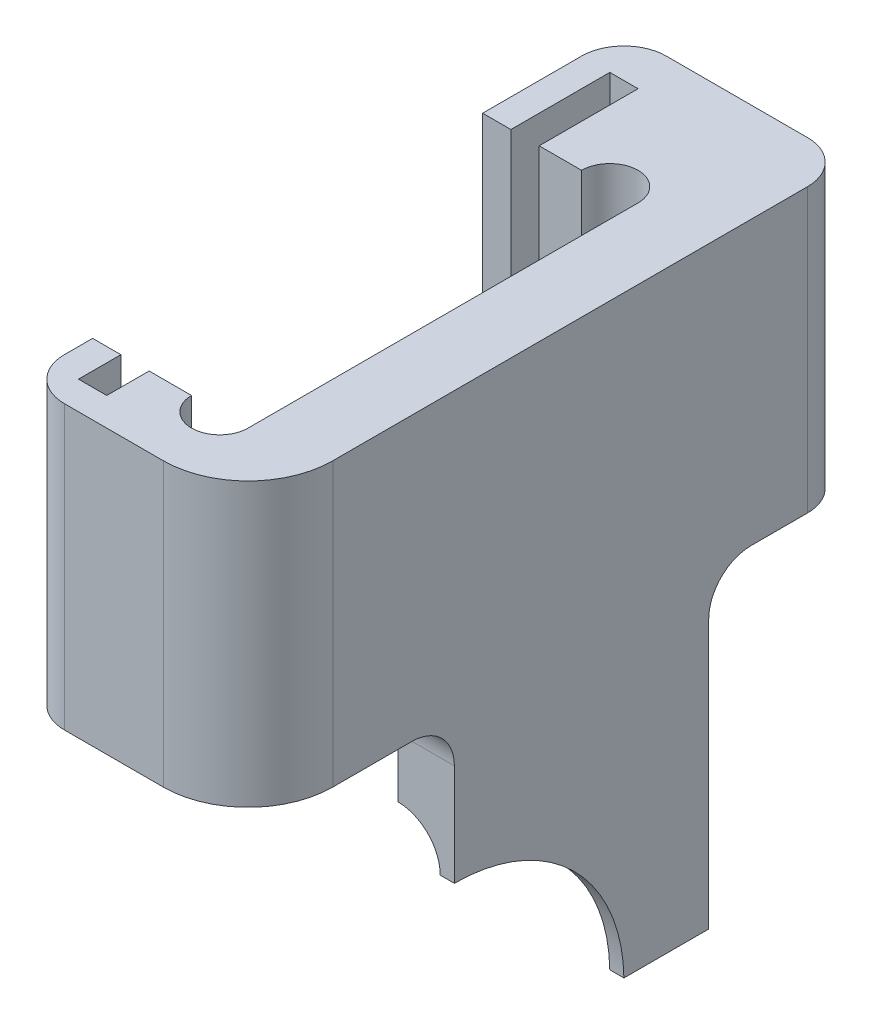
ISO-10303-21;
HEADER;
FILE_DESCRIPTION(('STEP AP214'),'2;1');
FILE_NAME('part.step','',(''),(''),'','','');
FILE_SCHEMA(('AUTOMOTIVE_DESIGN { 1 0 10303 214 1 1 1 1 }'));
ENDSEC;
DATA;
#1=APPLICATION_CONTEXT('core data for automotive mechanical design processes');
#2=APPLICATION_PROTOCOL_DEFINITION('international standard','automotive_design',2000,#1);
#3=PRODUCT_CONTEXT('',#1,'mechanical');
#4=PRODUCT('Part','Part','',(#3));
#5=PRODUCT_RELATED_PRODUCT_CATEGORY('part','',(#4));
#6=PRODUCT_DEFINITION_FORMATION('','',#4);
#7=PRODUCT_DEFINITION_CONTEXT('part definition',#1,'design');
#8=PRODUCT_DEFINITION('design','',#6,#7);
#9=PRODUCT_DEFINITION_SHAPE('','',#8);
#10=(LENGTH_UNIT() NAMED_UNIT(*) SI_UNIT(.MILLI.,.METRE.));
#11=(NAMED_UNIT(*) PLANE_ANGLE_UNIT() SI_UNIT($,.RADIAN.));
#12=(NAMED_UNIT(*) SI_UNIT($,.STERADIAN.) SOLID_ANGLE_UNIT());
#13=UNCERTAINTY_MEASURE_WITH_UNIT(LENGTH_MEASURE(1.E-05),#10,'distance_accuracy_value','');
#14=(GEOMETRIC_REPRESENTATION_CONTEXT(3) GLOBAL_UNCERTAINTY_ASSIGNED_CONTEXT((#13)) GLOBAL_UNIT_ASSIGNED_CONTEXT((#10,
#11,#12)) REPRESENTATION_CONTEXT('',''));
#15=CARTESIAN_POINT('',(0.,0.,0.));
#16=DIRECTION('',(0.,0.,1.));
#17=DIRECTION('',(1.,0.,0.));
#18=AXIS2_PLACEMENT_3D('',#15,#16,#17);
#19=CARTESIAN_POINT('',(0.,20.,0.));
#20=DIRECTION('',(1.,0.,0.));
#21=DIRECTION('',(0.,0.,-1.));
#22=AXIS2_PLACEMENT_3D('',#19,#20,#21);
#23=PLANE('',#22);
#24=DIRECTION('',(0.,-1.,0.));
#25=VECTOR('',#24,1.);
#26=CARTESIAN_POINT('',(0.,20.,-15.3));
#27=LINE('',#26,#25);
#28=CARTESIAN_POINT('',(0.,20.,-15.3));
#29=VERTEX_POINT('',#28);
#30=CARTESIAN_POINT('',(0.,0.,-15.3));
#31=VERTEX_POINT('',#30);
#32=EDGE_CURVE('E363',#29,#31,#27,.T.);
#33=ORIENTED_EDGE('',*,*,#32,.T.);
#34=DIRECTION('',(0.,0.,1.));
#35=VECTOR('',#34,1.);
#36=CARTESIAN_POINT('',(0.,0.,0.));
#37=LINE('',#36,#35);
#38=CARTESIAN_POINT('',(0.,0.,12.3));
#39=VERTEX_POINT('',#38);
#40=EDGE_CURVE('E339',#31,#39,#37,.T.);
#41=ORIENTED_EDGE('',*,*,#40,.T.);
#42=DIRECTION('',(0.,-1.,0.));
#43=VECTOR('',#42,1.);
#44=CARTESIAN_POINT('',(0.,20.,12.3));
#45=LINE('',#44,#43);
#46=CARTESIAN_POINT('',(0.,20.,12.3));
#47=VERTEX_POINT('',#46);
#48=EDGE_CURVE('E398',#47,#39,#45,.T.);
#49=ORIENTED_EDGE('',*,*,#48,.F.);
#50=DIRECTION('',(0.,0.,1.));
#51=VECTOR('',#50,1.);
#52=CARTESIAN_POINT('',(0.,20.,0.));
#53=LINE('',#52,#51);
#54=EDGE_CURVE('E340',#29,#47,#53,.T.);
#55=ORIENTED_EDGE('',*,*,#54,.F.);
#56=EDGE_LOOP('',(#33,#41,#49,#55));
#57=FACE_BOUND('',#56,.T.);
#58=ADVANCED_FACE('F41',(#57),#23,.F.);
#59=CARTESIAN_POINT('',(-11.,20.,-22.3));
#60=DIRECTION('',(0.,0.,-1.));
#61=DIRECTION('',(-1.,0.,0.));
#62=AXIS2_PLACEMENT_3D('',#59,#60,#61);
#63=PLANE('',#62);
#64=DIRECTION('',(0.,1.,0.));
#65=VECTOR('',#64,1.);
#66=CARTESIAN_POINT('',(-8.99999999999999,20.,-22.3));
#67=LINE('',#66,#65);
#68=CARTESIAN_POINT('',(-8.99999999999999,0.,-22.3));
#69=VERTEX_POINT('',#68);
#70=CARTESIAN_POINT('',(-8.99999999999999,20.,-22.3));
#71=VERTEX_POINT('',#70);
#72=EDGE_CURVE('E265',#69,#71,#67,.T.);
#73=ORIENTED_EDGE('',*,*,#72,.F.);
#74=DIRECTION('',(1.,0.,0.));
#75=VECTOR('',#74,1.);
#76=CARTESIAN_POINT('',(-11.,0.,-22.3));
#77=LINE('',#76,#75);
#78=CARTESIAN_POINT('',(-7.,0.,-22.3));
#79=VERTEX_POINT('',#78);
#80=EDGE_CURVE('E304',#69,#79,#77,.T.);
#81=ORIENTED_EDGE('',*,*,#80,.T.);
#82=DIRECTION('',(0.,1.,0.));
#83=VECTOR('',#82,1.);
#84=CARTESIAN_POINT('',(-7.,20.,-22.3));
#85=LINE('',#84,#83);
#86=CARTESIAN_POINT('',(-7.,20.,-22.3));
#87=VERTEX_POINT('',#86);
#88=EDGE_CURVE('E309',#79,#87,#85,.T.);
#89=ORIENTED_EDGE('',*,*,#88,.T.);
#90=DIRECTION('',(1.,0.,0.));
#91=VECTOR('',#90,1.);
#92=CARTESIAN_POINT('',(-11.,20.,-22.3));
#93=LINE('',#92,#91);
#94=EDGE_CURVE('E306',#71,#87,#93,.T.);
#95=ORIENTED_EDGE('',*,*,#94,.F.);
#96=EDGE_LOOP('',(#73,#81,#89,#95));
#97=FACE_BOUND('',#96,.T.);
#98=ADVANCED_FACE('F483',(#97),#63,.F.);
#99=CARTESIAN_POINT('',(-11.,20.,15.3));
#100=DIRECTION('',(0.,0.,1.));
#101=DIRECTION('',(1.,0.,0.));
#102=AXIS2_PLACEMENT_3D('',#99,#100,#101);
#103=PLANE('',#102);
#104=DIRECTION('',(0.,-1.,0.));
#105=VECTOR('',#104,1.);
#106=CARTESIAN_POINT('',(-8.99999999999999,20.,15.3));
#107=LINE('',#106,#105);
#108=CARTESIAN_POINT('',(-8.99999999999999,20.,15.3));
#109=VERTEX_POINT('',#108);
#110=CARTESIAN_POINT('',(-8.99999999999999,0.,15.3));
#111=VERTEX_POINT('',#110);
#112=EDGE_CURVE('E277',#109,#111,#107,.T.);
#113=ORIENTED_EDGE('',*,*,#112,.F.);
#114=DIRECTION('',(1.,0.,0.));
#115=VECTOR('',#114,1.);
#116=CARTESIAN_POINT('',(-11.,20.,15.3));
#117=LINE('',#116,#115);
#118=CARTESIAN_POINT('',(-7.,20.,15.3));
#119=VERTEX_POINT('',#118);
#120=EDGE_CURVE('E326',#109,#119,#117,.T.);
#121=ORIENTED_EDGE('',*,*,#120,.T.);
#122=DIRECTION('',(0.,-1.,0.));
#123=VECTOR('',#122,1.);
#124=CARTESIAN_POINT('',(-6.99999999999999,20.,15.3));
#125=LINE('',#124,#123);
#126=CARTESIAN_POINT('',(-7.,0.,15.3));
#127=VERTEX_POINT('',#126);
#128=EDGE_CURVE('E312',#119,#127,#125,.T.);
#129=ORIENTED_EDGE('',*,*,#128,.T.);
#130=DIRECTION('',(1.,0.,0.));
#131=VECTOR('',#130,1.);
#132=CARTESIAN_POINT('',(-11.,0.,15.3));
#133=LINE('',#132,#131);
#134=EDGE_CURVE('E322',#111,#127,#133,.T.);
#135=ORIENTED_EDGE('',*,*,#134,.F.);
#136=EDGE_LOOP('',(#113,#121,#129,#135));
#137=FACE_BOUND('',#136,.T.);
#138=ADVANCED_FACE('F486',(#137),#103,.F.);
#139=CARTESIAN_POINT('',(-7.,20.,0.));
#140=DIRECTION('',(-1.,0.,0.));
#141=DIRECTION('',(0.,0.,1.));
#142=AXIS2_PLACEMENT_3D('',#139,#140,#141);
#143=PLANE('',#142);
#144=DIRECTION('',(0.,0.,-1.));
#145=VECTOR('',#144,1.);
#146=CARTESIAN_POINT('',(-7.,20.,0.));
#147=LINE('',#146,#145);
#148=CARTESIAN_POINT('',(-7.,20.,-15.3));
#149=VERTEX_POINT('',#148);
#150=EDGE_CURVE('E355',#149,#87,#147,.T.);
#151=ORIENTED_EDGE('',*,*,#150,.T.);
#152=ORIENTED_EDGE('',*,*,#88,.F.);
#153=DIRECTION('',(0.,0.,-1.));
#154=VECTOR('',#153,1.);
#155=CARTESIAN_POINT('',(-7.,0.,0.));
#156=LINE('',#155,#154);
#157=CARTESIAN_POINT('',(-7.,0.,-15.3));
#158=VERTEX_POINT('',#157);
#159=EDGE_CURVE('E378',#158,#79,#156,.T.);
#160=ORIENTED_EDGE('',*,*,#159,.F.);
#161=DIRECTION('',(0.,-1.,0.));
#162=VECTOR('',#161,1.);
#163=CARTESIAN_POINT('',(-7.,20.,-15.3));
#164=LINE('',#163,#162);
#165=EDGE_CURVE('E390',#149,#158,#164,.T.);
#166=ORIENTED_EDGE('',*,*,#165,.F.);
#167=EDGE_LOOP('',(#151,#152,#160,#166));
#168=FACE_BOUND('',#167,.T.);
#169=ADVANCED_FACE('F498',(#168),#143,.T.);
#170=CARTESIAN_POINT('',(-7.,20.,0.));
#171=DIRECTION('',(1.,0.,0.));
#172=DIRECTION('',(0.,0.,-1.));
#173=AXIS2_PLACEMENT_3D('',#170,#171,#172);
#174=PLANE('',#173);
#175=ORIENTED_EDGE('',*,*,#128,.F.);
#176=DIRECTION('',(0.,0.,1.));
#177=VECTOR('',#176,1.);
#178=CARTESIAN_POINT('',(-7.,20.,0.));
#179=LINE('',#178,#177);
#180=CARTESIAN_POINT('',(-7.,20.,12.3));
#181=VERTEX_POINT('',#180);
#182=EDGE_CURVE('E348',#181,#119,#179,.T.);
#183=ORIENTED_EDGE('',*,*,#182,.F.);
#184=DIRECTION('',(0.,-1.,0.));
#185=VECTOR('',#184,1.);
#186=CARTESIAN_POINT('',(-7.,20.,12.3));
#187=LINE('',#186,#185);
#188=CARTESIAN_POINT('',(-7.,0.,12.3));
#189=VERTEX_POINT('',#188);
#190=EDGE_CURVE('E392',#181,#189,#187,.T.);
#191=ORIENTED_EDGE('',*,*,#190,.T.);
#192=DIRECTION('',(0.,0.,1.));
#193=VECTOR('',#192,1.);
#194=CARTESIAN_POINT('',(-7.,0.,0.));
#195=LINE('',#194,#193);
#196=EDGE_CURVE('E369',#189,#127,#195,.T.);
#197=ORIENTED_EDGE('',*,*,#196,.T.);
#198=EDGE_LOOP('',(#175,#183,#191,#197));
#199=FACE_BOUND('',#198,.T.);
#200=ADVANCED_FACE('F532',(#199),#174,.F.);
#201=CARTESIAN_POINT('',(-2.,20.,12.3));
#202=DIRECTION('',(0.,-1.,0.));
#203=DIRECTION('',(0.,0.,-1.));
#204=AXIS2_PLACEMENT_3D('',#201,#202,#203);
#205=CYLINDRICAL_SURFACE('',#204,2.);
#206=CARTESIAN_POINT('',(-2.,0.,12.3));
#207=DIRECTION('',(0.,1.,0.));
#208=DIRECTION('',(0.,0.,1.));
#209=AXIS2_PLACEMENT_3D('',#206,#207,#208);
#210=CIRCLE('',#209,2.);
#211=CARTESIAN_POINT('',(-4.,0.,12.3));
#212=VERTEX_POINT('',#211);
#213=EDGE_CURVE('E365',#39,#212,#210,.F.);
#214=ORIENTED_EDGE('',*,*,#213,.T.);
#215=DIRECTION('',(0.,-1.,0.));
#216=VECTOR('',#215,1.);
#217=CARTESIAN_POINT('',(-4.,20.,12.3));
#218=LINE('',#217,#216);
#219=CARTESIAN_POINT('',(-4.,20.,12.3));
#220=VERTEX_POINT('',#219);
#221=EDGE_CURVE('E395',#220,#212,#218,.T.);
#222=ORIENTED_EDGE('',*,*,#221,.F.);
#223=CARTESIAN_POINT('',(-2.,20.,12.3));
#224=DIRECTION('',(0.,1.,0.));
#225=DIRECTION('',(0.,0.,1.));
#226=AXIS2_PLACEMENT_3D('',#223,#224,#225);
#227=CIRCLE('',#226,2.);
#228=EDGE_CURVE('E343',#47,#220,#227,.F.);
#229=ORIENTED_EDGE('',*,*,#228,.F.);
#230=ORIENTED_EDGE('',*,*,#48,.T.);
#231=EDGE_LOOP('',(#214,#222,#229,#230));
#232=FACE_BOUND('',#231,.T.);
#233=ADVANCED_FACE('F543',(#232),#205,.F.);
#234=CARTESIAN_POINT('',(0.,20.,12.3));
#235=DIRECTION('',(0.,0.,1.));
#236=DIRECTION('',(1.,0.,0.));
#237=AXIS2_PLACEMENT_3D('',#234,#235,#236);
#238=PLANE('',#237);
#239=DIRECTION('',(-1.,0.,0.));
#240=VECTOR('',#239,1.);
#241=CARTESIAN_POINT('',(0.,0.,12.3));
#242=LINE('',#241,#240);
#243=EDGE_CURVE('E367',#212,#189,#242,.T.);
#244=ORIENTED_EDGE('',*,*,#243,.T.);
#245=ORIENTED_EDGE('',*,*,#190,.F.);
#246=DIRECTION('',(-1.,0.,0.));
#247=VECTOR('',#246,1.);
#248=CARTESIAN_POINT('',(0.,20.,12.3));
#249=LINE('',#248,#247);
#250=EDGE_CURVE('E346',#220,#181,#249,.T.);
#251=ORIENTED_EDGE('',*,*,#250,.F.);
#252=ORIENTED_EDGE('',*,*,#221,.T.);
#253=EDGE_LOOP('',(#244,#245,#251,#252));
#254=FACE_BOUND('',#253,.T.);
#255=ADVANCED_FACE('F539',(#254),#238,.F.);
#256=CARTESIAN_POINT('',(0.,20.,17.3));
#257=DIRECTION('',(0.,0.,-1.));
#258=DIRECTION('',(-1.,0.,0.));
#259=AXIS2_PLACEMENT_3D('',#256,#257,#258);
#260=PLANE('',#259);
#261=DIRECTION('',(1.,0.,0.));
#262=VECTOR('',#261,1.);
#263=CARTESIAN_POINT('',(0.,20.,17.3));
#264=LINE('',#263,#262);
#265=CARTESIAN_POINT('',(-7.99999999999999,20.,17.3));
#266=VERTEX_POINT('',#265);
#267=CARTESIAN_POINT('',(-0.999999999999993,20.,17.3));
#268=VERTEX_POINT('',#267);
#269=EDGE_CURVE('E351',#266,#268,#264,.T.);
#270=ORIENTED_EDGE('',*,*,#269,.F.);
#271=DIRECTION('',(0.,1.,0.));
#272=VECTOR('',#271,1.);
#273=CARTESIAN_POINT('',(-7.99999999999999,20.,17.3));
#274=LINE('',#273,#272);
#275=CARTESIAN_POINT('',(-7.99999999999999,0.,17.3));
#276=VERTEX_POINT('',#275);
#277=EDGE_CURVE('E430',#266,#276,#274,.F.);
#278=ORIENTED_EDGE('',*,*,#277,.T.);
#279=DIRECTION('',(1.,0.,0.));
#280=VECTOR('',#279,1.);
#281=CARTESIAN_POINT('',(0.,0.,17.3));
#282=LINE('',#281,#280);
#283=CARTESIAN_POINT('',(-0.999999999999993,0.,17.3));
#284=VERTEX_POINT('',#283);
#285=EDGE_CURVE('E372',#276,#284,#282,.T.);
#286=ORIENTED_EDGE('',*,*,#285,.T.);
#287=DIRECTION('',(0.,-1.,0.));
#288=VECTOR('',#287,1.);
#289=CARTESIAN_POINT('',(-0.999999999999993,20.,17.3));
#290=LINE('',#289,#288);
#291=EDGE_CURVE('E407',#284,#268,#290,.F.);
#292=ORIENTED_EDGE('',*,*,#291,.T.);
#293=EDGE_LOOP('',(#270,#278,#286,#292));
#294=FACE_BOUND('',#293,.T.);
#295=ADVANCED_FACE('F536',(#294),#260,.F.);
#296=CARTESIAN_POINT('',(5.,20.,0.));
#297=DIRECTION('',(1.,0.,0.));
#298=DIRECTION('',(0.,0.,-1.));
#299=AXIS2_PLACEMENT_3D('',#296,#297,#298);
#300=PLANE('',#299);
#301=DIRECTION('',(0.,0.,1.));
#302=VECTOR('',#301,1.);
#303=CARTESIAN_POINT('',(5.,0.,0.));
#304=LINE('',#303,#302);
#305=CARTESIAN_POINT('',(5.,0.,5.7));
#306=VERTEX_POINT('',#305);
#307=CARTESIAN_POINT('',(5.,0.,11.3));
#308=VERTEX_POINT('',#307);
#309=EDGE_CURVE('E374',#306,#308,#304,.T.);
#310=ORIENTED_EDGE('',*,*,#309,.F.);
#311=CARTESIAN_POINT('',(5.,-3.,5.7));
#312=DIRECTION('',(1.,0.,0.));
#313=DIRECTION('',(0.,0.,-1.));
#314=AXIS2_PLACEMENT_3D('',#311,#312,#313);
#315=CIRCLE('',#314,3.);
#316=CARTESIAN_POINT('',(5.,-3.,2.7));
#317=VERTEX_POINT('',#316);
#318=EDGE_CURVE('E11',#306,#317,#315,.F.);
#319=ORIENTED_EDGE('',*,*,#318,.T.);
#320=DIRECTION('',(0.,-1.,0.));
#321=VECTOR('',#320,1.);
#322=CARTESIAN_POINT('',(5.,0.,2.7));
#323=LINE('',#322,#321);
#324=CARTESIAN_POINT('',(5.,-10.2,2.7));
#325=VERTEX_POINT('',#324);
#326=EDGE_CURVE('E654',#317,#325,#323,.T.);
#327=ORIENTED_EDGE('',*,*,#326,.T.);
#328=CARTESIAN_POINT('',(5.,-22.2,2.7));
#329=DIRECTION('',(1.,0.,0.));
#330=DIRECTION('',(0.,0.,-1.));
#331=AXIS2_PLACEMENT_3D('',#328,#329,#330);
#332=CIRCLE('',#331,12.);
#333=CARTESIAN_POINT('',(5.,-22.,-9.29833321757652));
#334=VERTEX_POINT('',#333);
#335=EDGE_CURVE('E650',#325,#334,#332,.F.);
#336=ORIENTED_EDGE('',*,*,#335,.T.);
#337=DIRECTION('',(0.,0.,1.));
#338=VECTOR('',#337,1.);
#339=CARTESIAN_POINT('',(5.,-22.,-15.3));
#340=LINE('',#339,#338);
#341=CARTESIAN_POINT('',(5.,-22.,-15.3));
#342=VERTEX_POINT('',#341);
#343=EDGE_CURVE('E267',#342,#334,#340,.T.);
#344=ORIENTED_EDGE('',*,*,#343,.F.);
#345=DIRECTION('',(0.,-1.,0.));
#346=VECTOR('',#345,1.);
#347=CARTESIAN_POINT('',(5.,0.,-15.3));
#348=LINE('',#347,#346);
#349=CARTESIAN_POINT('',(5.,-3.,-15.3));
#350=VERTEX_POINT('',#349);
#351=EDGE_CURVE('E262',#350,#342,#348,.T.);
#352=ORIENTED_EDGE('',*,*,#351,.F.);
#353=CARTESIAN_POINT('',(5.,-3.,-18.3));
#354=DIRECTION('',(1.,0.,0.));
#355=DIRECTION('',(0.,0.,-1.));
#356=AXIS2_PLACEMENT_3D('',#353,#354,#355);
#357=CIRCLE('',#356,3.);
#358=CARTESIAN_POINT('',(5.,0.,-18.3));
#359=VERTEX_POINT('',#358);
#360=EDGE_CURVE('E626',#350,#359,#357,.F.);
#361=ORIENTED_EDGE('',*,*,#360,.T.);
#362=CARTESIAN_POINT('',(5.,0.,-22.3));
#363=VERTEX_POINT('',#362);
#364=EDGE_CURVE('E375',#363,#359,#304,.T.);
#365=ORIENTED_EDGE('',*,*,#364,.F.);
#366=DIRECTION('',(0.,-1.,0.));
#367=VECTOR('',#366,1.);
#368=CARTESIAN_POINT('',(5.,20.,-22.3));
#369=LINE('',#368,#367);
#370=CARTESIAN_POINT('',(5.,20.,-22.3));
#371=VERTEX_POINT('',#370);
#372=EDGE_CURVE('E418',#363,#371,#369,.F.);
#373=ORIENTED_EDGE('',*,*,#372,.T.);
#374=DIRECTION('',(0.,0.,1.));
#375=VECTOR('',#374,1.);
#376=CARTESIAN_POINT('',(5.,20.,0.));
#377=LINE('',#376,#375);
#378=CARTESIAN_POINT('',(5.,20.,11.3));
#379=VERTEX_POINT('',#378);
#380=EDGE_CURVE('E353',#371,#379,#377,.T.);
#381=ORIENTED_EDGE('',*,*,#380,.T.);
#382=DIRECTION('',(0.,-1.,0.));
#383=VECTOR('',#382,1.);
#384=CARTESIAN_POINT('',(5.,0.,11.3));
#385=LINE('',#384,#383);
#386=EDGE_CURVE('E401',#379,#308,#385,.T.);
#387=ORIENTED_EDGE('',*,*,#386,.T.);
#388=EDGE_LOOP('',(#310,#319,#327,#336,#344,#352,#361,#365,#373,#381,#387));
#389=FACE_BOUND('',#388,.T.);
#390=ADVANCED_FACE('F528',(#389),#300,.T.);
#391=CARTESIAN_POINT('',(0.,20.,-15.3));
#392=DIRECTION('',(0.,0.,1.));
#393=DIRECTION('',(1.,0.,0.));
#394=AXIS2_PLACEMENT_3D('',#391,#392,#393);
#395=PLANE('',#394);
#396=DIRECTION('',(-1.,0.,0.));
#397=VECTOR('',#396,1.);
#398=CARTESIAN_POINT('',(0.,0.,-15.3));
#399=LINE('',#398,#397);
#400=CARTESIAN_POINT('',(-4.,0.,-15.3));
#401=VERTEX_POINT('',#400);
#402=EDGE_CURVE('E381',#401,#158,#399,.T.);
#403=ORIENTED_EDGE('',*,*,#402,.F.);
#404=DIRECTION('',(0.,-1.,0.));
#405=VECTOR('',#404,1.);
#406=CARTESIAN_POINT('',(-4.,20.,-15.3));
#407=LINE('',#406,#405);
#408=CARTESIAN_POINT('',(-4.,20.,-15.3));
#409=VERTEX_POINT('',#408);
#410=EDGE_CURVE('E388',#409,#401,#407,.T.);
#411=ORIENTED_EDGE('',*,*,#410,.F.);
#412=DIRECTION('',(-1.,0.,0.));
#413=VECTOR('',#412,1.);
#414=CARTESIAN_POINT('',(0.,20.,-15.3));
#415=LINE('',#414,#413);
#416=EDGE_CURVE('E358',#409,#149,#415,.T.);
#417=ORIENTED_EDGE('',*,*,#416,.T.);
#418=ORIENTED_EDGE('',*,*,#165,.T.);
#419=EDGE_LOOP('',(#403,#411,#417,#418));
#420=FACE_BOUND('',#419,.T.);
#421=ADVANCED_FACE('F524',(#420),#395,.T.);
#422=CARTESIAN_POINT('',(-2.,20.,-15.3));
#423=DIRECTION('',(0.,-1.,0.));
#424=DIRECTION('',(0.,0.,-1.));
#425=AXIS2_PLACEMENT_3D('',#422,#423,#424);
#426=CYLINDRICAL_SURFACE('',#425,2.);
#427=CARTESIAN_POINT('',(-2.,0.,-15.3));
#428=DIRECTION('',(0.,1.,0.));
#429=DIRECTION('',(0.,0.,1.));
#430=AXIS2_PLACEMENT_3D('',#427,#428,#429);
#431=CIRCLE('',#430,2.);
#432=EDGE_CURVE('E344',#401,#31,#431,.F.);
#433=ORIENTED_EDGE('',*,*,#432,.T.);
#434=ORIENTED_EDGE('',*,*,#32,.F.);
#435=CARTESIAN_POINT('',(-2.,20.,-15.3));
#436=DIRECTION('',(0.,1.,0.));
#437=DIRECTION('',(0.,0.,1.));
#438=AXIS2_PLACEMENT_3D('',#435,#436,#437);
#439=CIRCLE('',#438,2.);
#440=EDGE_CURVE('E361',#409,#29,#439,.F.);
#441=ORIENTED_EDGE('',*,*,#440,.F.);
#442=ORIENTED_EDGE('',*,*,#410,.T.);
#443=EDGE_LOOP('',(#433,#434,#441,#442));
#444=FACE_BOUND('',#443,.T.);
#445=ADVANCED_FACE('F517',(#444),#426,.F.);
#446=CARTESIAN_POINT('',(0.,20.,0.));
#447=DIRECTION('',(0.,1.,0.));
#448=DIRECTION('',(0.,0.,1.));
#449=AXIS2_PLACEMENT_3D('',#446,#447,#448);
#450=PLANE('',#449);
#451=DIRECTION('',(0.,0.,-1.));
#452=VECTOR('',#451,1.);
#453=CARTESIAN_POINT('',(-11.,20.,17.3));
#454=LINE('',#453,#452);
#455=CARTESIAN_POINT('',(-11.,20.,14.3));
#456=VERTEX_POINT('',#455);
#457=CARTESIAN_POINT('',(-11.,20.,12.3));
#458=VERTEX_POINT('',#457);
#459=EDGE_CURVE('E317',#456,#458,#454,.T.);
#460=ORIENTED_EDGE('',*,*,#459,.F.);
#461=CARTESIAN_POINT('',(-7.99999999999999,20.,14.3));
#462=DIRECTION('',(0.,1.,0.));
#463=DIRECTION('',(0.,0.,1.));
#464=AXIS2_PLACEMENT_3D('',#461,#462,#463);
#465=CIRCLE('',#464,3.);
#466=EDGE_CURVE('E428',#456,#266,#465,.T.);
#467=ORIENTED_EDGE('',*,*,#466,.T.);
#468=ORIENTED_EDGE('',*,*,#269,.T.);
#469=CARTESIAN_POINT('',(-0.999999999999997,20.,11.3));
#470=DIRECTION('',(0.,1.,0.));
#471=DIRECTION('',(0.,0.,1.));
#472=AXIS2_PLACEMENT_3D('',#469,#470,#471);
#473=CIRCLE('',#472,6.);
#474=EDGE_CURVE('E410',#268,#379,#473,.T.);
#475=ORIENTED_EDGE('',*,*,#474,.T.);
#476=ORIENTED_EDGE('',*,*,#380,.F.);
#477=CARTESIAN_POINT('',(2.,20.,-22.3));
#478=DIRECTION('',(0.,1.,0.));
#479=DIRECTION('',(0.,0.,1.));
#480=AXIS2_PLACEMENT_3D('',#477,#478,#479);
#481=CIRCLE('',#480,3.);
#482=CARTESIAN_POINT('',(2.,20.,-25.3));
#483=VERTEX_POINT('',#482);
#484=EDGE_CURVE('E420',#371,#483,#481,.T.);
#485=ORIENTED_EDGE('',*,*,#484,.T.);
#486=DIRECTION('',(1.,0.,0.));
#487=VECTOR('',#486,1.);
#488=CARTESIAN_POINT('',(5.,20.,-25.3));
#489=LINE('',#488,#487);
#490=CARTESIAN_POINT('',(-8.00000000000001,20.,-25.3));
#491=VERTEX_POINT('',#490);
#492=EDGE_CURVE('E337',#491,#483,#489,.T.);
#493=ORIENTED_EDGE('',*,*,#492,.F.);
#494=CARTESIAN_POINT('',(-8.00000000000001,20.,-22.3));
#495=DIRECTION('',(0.,1.,0.));
#496=DIRECTION('',(0.,0.,1.));
#497=AXIS2_PLACEMENT_3D('',#494,#495,#496);
#498=CIRCLE('',#497,3.);
#499=CARTESIAN_POINT('',(-11.,20.,-22.3));
#500=VERTEX_POINT('',#499);
#501=EDGE_CURVE('E426',#491,#500,#498,.T.);
#502=ORIENTED_EDGE('',*,*,#501,.T.);
#503=DIRECTION('',(0.,0.,-1.));
#504=VECTOR('',#503,1.);
#505=CARTESIAN_POINT('',(-11.,20.,-25.3));
#506=LINE('',#505,#504);
#507=CARTESIAN_POINT('',(-11.,20.,-15.3));
#508=VERTEX_POINT('',#507);
#509=EDGE_CURVE('E308',#508,#500,#506,.T.);
#510=ORIENTED_EDGE('',*,*,#509,.F.);
#511=DIRECTION('',(-1.,0.,0.));
#512=VECTOR('',#511,1.);
#513=CARTESIAN_POINT('',(-11.,20.,-15.3));
#514=LINE('',#513,#512);
#515=CARTESIAN_POINT('',(-8.99999999999999,20.,-15.3));
#516=VERTEX_POINT('',#515);
#517=EDGE_CURVE('E284',#516,#508,#514,.T.);
#518=ORIENTED_EDGE('',*,*,#517,.F.);
#519=DIRECTION('',(0.,0.,-1.));
#520=VECTOR('',#519,1.);
#521=CARTESIAN_POINT('',(-8.99999999999999,20.,4.79975124224178));
#522=LINE('',#521,#520);
#523=EDGE_CURVE('E273',#516,#71,#522,.T.);
#524=ORIENTED_EDGE('',*,*,#523,.T.);
#525=ORIENTED_EDGE('',*,*,#94,.T.);
#526=ORIENTED_EDGE('',*,*,#150,.F.);
#527=ORIENTED_EDGE('',*,*,#416,.F.);
#528=ORIENTED_EDGE('',*,*,#440,.T.);
#529=ORIENTED_EDGE('',*,*,#54,.T.);
#530=ORIENTED_EDGE('',*,*,#228,.T.);
#531=ORIENTED_EDGE('',*,*,#250,.T.);
#532=ORIENTED_EDGE('',*,*,#182,.T.);
#533=ORIENTED_EDGE('',*,*,#120,.F.);
#534=DIRECTION('',(0.,0.,1.));
#535=VECTOR('',#534,1.);
#536=CARTESIAN_POINT('',(-8.99999999999999,20.,12.3));
#537=LINE('',#536,#535);
#538=CARTESIAN_POINT('',(-8.99999999999999,20.,12.3));
#539=VERTEX_POINT('',#538);
#540=EDGE_CURVE('E302',#539,#109,#537,.T.);
#541=ORIENTED_EDGE('',*,*,#540,.F.);
#542=DIRECTION('',(1.,0.,0.));
#543=VECTOR('',#542,1.);
#544=CARTESIAN_POINT('',(-11.,20.,12.3));
#545=LINE('',#544,#543);
#546=EDGE_CURVE('E291',#458,#539,#545,.T.);
#547=ORIENTED_EDGE('',*,*,#546,.F.);
#548=EDGE_LOOP('',(#460,#467,#468,#475,#476,#485,#493,#502,#510,#518,#524,#525,#526,#527,#528,
#529,#530,#531,#532,#533,#541,#547));
#549=FACE_BOUND('',#548,.T.);
#550=ADVANCED_FACE('F514',(#549),#450,.T.);
#551=CARTESIAN_POINT('',(0.,0.,0.));
#552=DIRECTION('',(0.,1.,0.));
#553=DIRECTION('',(0.,0.,1.));
#554=AXIS2_PLACEMENT_3D('',#551,#552,#553);
#555=PLANE('',#554);
#556=ORIENTED_EDGE('',*,*,#364,.T.);
#557=DIRECTION('',(-1.,0.,0.));
#558=VECTOR('',#557,1.);
#559=CARTESIAN_POINT('',(0.,0.,-18.3));
#560=LINE('',#559,#558);
#561=CARTESIAN_POINT('',(0.999999999999998,0.,-18.3));
#562=VERTEX_POINT('',#561);
#563=EDGE_CURVE('E635',#359,#562,#560,.T.);
#564=ORIENTED_EDGE('',*,*,#563,.T.);
#565=DIRECTION('',(0.,0.,-1.));
#566=VECTOR('',#565,1.);
#567=CARTESIAN_POINT('',(0.999999999999998,0.,-15.3));
#568=LINE('',#567,#566);
#569=CARTESIAN_POINT('',(1.,0.,5.7));
#570=VERTEX_POINT('',#569);
#571=EDGE_CURVE('E652',#570,#562,#568,.T.);
#572=ORIENTED_EDGE('',*,*,#571,.F.);
#573=DIRECTION('',(-1.,0.,0.));
#574=VECTOR('',#573,1.);
#575=CARTESIAN_POINT('',(5.,0.,5.7));
#576=LINE('',#575,#574);
#577=EDGE_CURVE('E636',#570,#306,#576,.F.);
#578=ORIENTED_EDGE('',*,*,#577,.T.);
#579=ORIENTED_EDGE('',*,*,#309,.T.);
#580=CARTESIAN_POINT('',(-0.999999999999997,0.,11.3));
#581=DIRECTION('',(0.,1.,0.));
#582=DIRECTION('',(0.,0.,1.));
#583=AXIS2_PLACEMENT_3D('',#580,#581,#582);
#584=CIRCLE('',#583,6.);
#585=EDGE_CURVE('E404',#308,#284,#584,.F.);
#586=ORIENTED_EDGE('',*,*,#585,.T.);
#587=ORIENTED_EDGE('',*,*,#285,.F.);
#588=CARTESIAN_POINT('',(-7.99999999999999,0.,14.3));
#589=DIRECTION('',(0.,1.,0.));
#590=DIRECTION('',(0.,0.,1.));
#591=AXIS2_PLACEMENT_3D('',#588,#589,#590);
#592=CIRCLE('',#591,3.);
#593=CARTESIAN_POINT('',(-11.,0.,14.3));
#594=VERTEX_POINT('',#593);
#595=EDGE_CURVE('E434',#276,#594,#592,.F.);
#596=ORIENTED_EDGE('',*,*,#595,.T.);
#597=DIRECTION('',(0.,0.,1.));
#598=VECTOR('',#597,1.);
#599=CARTESIAN_POINT('',(-11.,0.,17.3));
#600=LINE('',#599,#598);
#601=CARTESIAN_POINT('',(-11.,0.,12.3));
#602=VERTEX_POINT('',#601);
#603=EDGE_CURVE('E319',#602,#594,#600,.T.);
#604=ORIENTED_EDGE('',*,*,#603,.F.);
#605=DIRECTION('',(-1.,0.,0.));
#606=VECTOR('',#605,1.);
#607=CARTESIAN_POINT('',(-11.,0.,12.3));
#608=LINE('',#607,#606);
#609=CARTESIAN_POINT('',(-9.,0.,12.3));
#610=VERTEX_POINT('',#609);
#611=EDGE_CURVE('E295',#610,#602,#608,.T.);
#612=ORIENTED_EDGE('',*,*,#611,.F.);
#613=DIRECTION('',(0.,0.,1.));
#614=VECTOR('',#613,1.);
#615=CARTESIAN_POINT('',(-9.,0.,12.3));
#616=LINE('',#615,#614);
#617=EDGE_CURVE('E298',#610,#111,#616,.T.);
#618=ORIENTED_EDGE('',*,*,#617,.T.);
#619=ORIENTED_EDGE('',*,*,#134,.T.);
#620=ORIENTED_EDGE('',*,*,#196,.F.);
#621=ORIENTED_EDGE('',*,*,#243,.F.);
#622=ORIENTED_EDGE('',*,*,#213,.F.);
#623=ORIENTED_EDGE('',*,*,#40,.F.);
#624=ORIENTED_EDGE('',*,*,#432,.F.);
#625=ORIENTED_EDGE('',*,*,#402,.T.);
#626=ORIENTED_EDGE('',*,*,#159,.T.);
#627=ORIENTED_EDGE('',*,*,#80,.F.);
#628=DIRECTION('',(0.,0.,-1.));
#629=VECTOR('',#628,1.);
#630=CARTESIAN_POINT('',(-8.99999999999999,0.,4.79975124224178));
#631=LINE('',#630,#629);
#632=CARTESIAN_POINT('',(-8.99999999999999,0.,-15.3));
#633=VERTEX_POINT('',#632);
#634=EDGE_CURVE('E263',#633,#69,#631,.T.);
#635=ORIENTED_EDGE('',*,*,#634,.F.);
#636=DIRECTION('',(1.,0.,0.));
#637=VECTOR('',#636,1.);
#638=CARTESIAN_POINT('',(-11.,0.,-15.3));
#639=LINE('',#638,#637);
#640=CARTESIAN_POINT('',(-11.,0.,-15.3));
#641=VERTEX_POINT('',#640);
#642=EDGE_CURVE('E278',#641,#633,#639,.T.);
#643=ORIENTED_EDGE('',*,*,#642,.F.);
#644=DIRECTION('',(0.,0.,1.));
#645=VECTOR('',#644,1.);
#646=CARTESIAN_POINT('',(-11.,0.,-25.3));
#647=LINE('',#646,#645);
#648=CARTESIAN_POINT('',(-11.,0.,-22.3));
#649=VERTEX_POINT('',#648);
#650=EDGE_CURVE('E313',#649,#641,#647,.T.);
#651=ORIENTED_EDGE('',*,*,#650,.F.);
#652=CARTESIAN_POINT('',(-8.00000000000001,0.,-22.3));
#653=DIRECTION('',(0.,1.,0.));
#654=DIRECTION('',(0.,0.,1.));
#655=AXIS2_PLACEMENT_3D('',#652,#653,#654);
#656=CIRCLE('',#655,3.);
#657=CARTESIAN_POINT('',(-8.00000000000001,0.,-25.3));
#658=VERTEX_POINT('',#657);
#659=EDGE_CURVE('E432',#649,#658,#656,.F.);
#660=ORIENTED_EDGE('',*,*,#659,.T.);
#661=DIRECTION('',(-1.,0.,0.));
#662=VECTOR('',#661,1.);
#663=CARTESIAN_POINT('',(5.,0.,-25.3));
#664=LINE('',#663,#662);
#665=CARTESIAN_POINT('',(2.,0.,-25.3));
#666=VERTEX_POINT('',#665);
#667=EDGE_CURVE('E332',#666,#658,#664,.T.);
#668=ORIENTED_EDGE('',*,*,#667,.F.);
#669=CARTESIAN_POINT('',(2.,0.,-22.3));
#670=DIRECTION('',(0.,1.,0.));
#671=DIRECTION('',(0.,0.,1.));
#672=AXIS2_PLACEMENT_3D('',#669,#670,#671);
#673=CIRCLE('',#672,3.);
#674=EDGE_CURVE('E416',#666,#363,#673,.F.);
#675=ORIENTED_EDGE('',*,*,#674,.T.);
#676=EDGE_LOOP('',(#556,#564,#572,#578,#579,#586,#587,#596,#604,#612,#618,#619,#620,#621,#622,
#623,#624,#625,#626,#627,#635,#643,#651,#660,#668,#675));
#677=FACE_BOUND('',#676,.T.);
#678=ADVANCED_FACE('F512',(#677),#555,.F.);
#679=CARTESIAN_POINT('',(0.,0.,-25.3));
#680=DIRECTION('',(0.,0.,-1.));
#681=DIRECTION('',(-1.,0.,0.));
#682=AXIS2_PLACEMENT_3D('',#679,#680,#681);
#683=PLANE('',#682);
#684=CARTESIAN_POINT('',(-0.500000000000001,10.,-25.3));
#685=DIRECTION('',(0.,0.,-1.));
#686=DIRECTION('',(-1.,0.,0.));
#687=AXIS2_PLACEMENT_3D('',#684,#685,#686);
#688=CIRCLE('',#687,2.);
#689=CARTESIAN_POINT('',(-2.5,10.,-25.3));
#690=VERTEX_POINT('',#689);
#691=EDGE_CURVE('E328',#690,#690,#688,.T.);
#692=ORIENTED_EDGE('',*,*,#691,.F.);
#693=EDGE_LOOP('',(#692));
#694=FACE_BOUND('',#693,.T.);
#695=ORIENTED_EDGE('',*,*,#667,.T.);
#696=DIRECTION('',(0.,-1.,0.));
#697=VECTOR('',#696,1.);
#698=CARTESIAN_POINT('',(-8.00000000000001,0.,-25.3));
#699=LINE('',#698,#697);
#700=EDGE_CURVE('E439',#658,#491,#699,.F.);
#701=ORIENTED_EDGE('',*,*,#700,.T.);
#702=ORIENTED_EDGE('',*,*,#492,.T.);
#703=DIRECTION('',(0.,-1.,0.));
#704=VECTOR('',#703,1.);
#705=CARTESIAN_POINT('',(2.,0.,-25.3));
#706=LINE('',#705,#704);
#707=EDGE_CURVE('E413',#483,#666,#706,.T.);
#708=ORIENTED_EDGE('',*,*,#707,.T.);
#709=EDGE_LOOP('',(#695,#701,#702,#708));
#710=FACE_BOUND('',#709,.T.);
#711=ADVANCED_FACE('F508',(#694,#710),#683,.T.);
#712=CARTESIAN_POINT('',(-0.999999999999997,20.,11.3));
#713=DIRECTION('',(0.,1.,0.));
#714=DIRECTION('',(0.,0.,1.));
#715=AXIS2_PLACEMENT_3D('',#712,#713,#714);
#716=CYLINDRICAL_SURFACE('',#715,6.);
#717=ORIENTED_EDGE('',*,*,#474,.F.);
#718=ORIENTED_EDGE('',*,*,#291,.F.);
#719=ORIENTED_EDGE('',*,*,#585,.F.);
#720=ORIENTED_EDGE('',*,*,#386,.F.);
#721=EDGE_LOOP('',(#717,#718,#719,#720));
#722=FACE_BOUND('',#721,.T.);
#723=ADVANCED_FACE('F511',(#722),#716,.T.);
#724=CARTESIAN_POINT('',(2.,0.,-22.3));
#725=DIRECTION('',(0.,-1.,0.));
#726=DIRECTION('',(0.,0.,-1.));
#727=AXIS2_PLACEMENT_3D('',#724,#725,#726);
#728=CYLINDRICAL_SURFACE('',#727,3.);
#729=ORIENTED_EDGE('',*,*,#484,.F.);
#730=ORIENTED_EDGE('',*,*,#372,.F.);
#731=ORIENTED_EDGE('',*,*,#674,.F.);
#732=ORIENTED_EDGE('',*,*,#707,.F.);
#733=EDGE_LOOP('',(#729,#730,#731,#732));
#734=FACE_BOUND('',#733,.T.);
#735=ADVANCED_FACE('F506',(#734),#728,.T.);
#736=CARTESIAN_POINT('',(-0.499999999999999,10.,-19.3));
#737=DIRECTION('',(0.,0.,-1.));
#738=DIRECTION('',(-1.,0.,0.));
#739=AXIS2_PLACEMENT_3D('',#736,#737,#738);
#740=CYLINDRICAL_SURFACE('',#739,2.);
#741=CARTESIAN_POINT('',(-0.499999999999999,10.,-19.3));
#742=DIRECTION('',(0.,0.,-1.));
#743=DIRECTION('',(-1.,0.,0.));
#744=AXIS2_PLACEMENT_3D('',#741,#742,#743);
#745=CIRCLE('',#744,2.);
#746=CARTESIAN_POINT('',(-2.5,10.,-19.3));
#747=VERTEX_POINT('',#746);
#748=EDGE_CURVE('E329',#747,#747,#745,.T.);
#749=ORIENTED_EDGE('',*,*,#748,.F.);
#750=EDGE_LOOP('',(#749));
#751=FACE_BOUND('',#750,.T.);
#752=ORIENTED_EDGE('',*,*,#691,.T.);
#753=EDGE_LOOP('',(#752));
#754=FACE_BOUND('',#753,.T.);
#755=ADVANCED_FACE('F502',(#751,#754),#740,.F.);
#756=CARTESIAN_POINT('',(-0.499999999999999,10.,-19.3));
#757=DIRECTION('',(0.,0.,-1.));
#758=DIRECTION('',(-1.,0.,0.));
#759=AXIS2_PLACEMENT_3D('',#756,#757,#758);
#760=PLANE('',#759);
#761=ORIENTED_EDGE('',*,*,#748,.T.);
#762=EDGE_LOOP('',(#761));
#763=FACE_BOUND('',#762,.T.);
#764=ADVANCED_FACE('F494',(#763),#760,.T.);
#765=CARTESIAN_POINT('',(-11.,0.,0.));
#766=DIRECTION('',(1.,0.,0.));
#767=DIRECTION('',(0.,0.,-1.));
#768=AXIS2_PLACEMENT_3D('',#765,#766,#767);
#769=PLANE('',#768);
#770=ORIENTED_EDGE('',*,*,#603,.T.);
#771=DIRECTION('',(0.,1.,0.));
#772=VECTOR('',#771,1.);
#773=CARTESIAN_POINT('',(-11.,0.,14.3));
#774=LINE('',#773,#772);
#775=EDGE_CURVE('E423',#594,#456,#774,.T.);
#776=ORIENTED_EDGE('',*,*,#775,.T.);
#777=ORIENTED_EDGE('',*,*,#459,.T.);
#778=DIRECTION('',(0.,1.,0.));
#779=VECTOR('',#778,1.);
#780=CARTESIAN_POINT('',(-11.,20.,12.3));
#781=LINE('',#780,#779);
#782=EDGE_CURVE('E288',#602,#458,#781,.T.);
#783=ORIENTED_EDGE('',*,*,#782,.F.);
#784=EDGE_LOOP('',(#770,#776,#777,#783));
#785=FACE_BOUND('',#784,.T.);
#786=ADVANCED_FACE('F490',(#785),#769,.F.);
#787=CARTESIAN_POINT('',(-11.,0.,0.));
#788=DIRECTION('',(-1.,0.,0.));
#789=DIRECTION('',(0.,0.,1.));
#790=AXIS2_PLACEMENT_3D('',#787,#788,#789);
#791=PLANE('',#790);
#792=ORIENTED_EDGE('',*,*,#509,.T.);
#793=DIRECTION('',(0.,-1.,0.));
#794=VECTOR('',#793,1.);
#795=CARTESIAN_POINT('',(-11.,0.,-22.3));
#796=LINE('',#795,#794);
#797=EDGE_CURVE('E436',#500,#649,#796,.T.);
#798=ORIENTED_EDGE('',*,*,#797,.T.);
#799=ORIENTED_EDGE('',*,*,#650,.T.);
#800=DIRECTION('',(0.,-1.,0.));
#801=VECTOR('',#800,1.);
#802=CARTESIAN_POINT('',(-11.,20.,-15.3));
#803=LINE('',#802,#801);
#804=EDGE_CURVE('E281',#508,#641,#803,.T.);
#805=ORIENTED_EDGE('',*,*,#804,.F.);
#806=EDGE_LOOP('',(#792,#798,#799,#805));
#807=FACE_BOUND('',#806,.T.);
#808=ADVANCED_FACE('F481',(#807),#791,.T.);
#809=CARTESIAN_POINT('',(-8.99999999999999,20.,12.3));
#810=DIRECTION('',(-1.,0.,0.));
#811=DIRECTION('',(0.,0.,1.));
#812=AXIS2_PLACEMENT_3D('',#809,#810,#811);
#813=PLANE('',#812);
#814=ORIENTED_EDGE('',*,*,#112,.T.);
#815=ORIENTED_EDGE('',*,*,#617,.F.);
#816=DIRECTION('',(0.,-1.,0.));
#817=VECTOR('',#816,1.);
#818=CARTESIAN_POINT('',(-8.99999999999999,20.,12.3));
#819=LINE('',#818,#817);
#820=EDGE_CURVE('E293',#539,#610,#819,.T.);
#821=ORIENTED_EDGE('',*,*,#820,.F.);
#822=ORIENTED_EDGE('',*,*,#540,.T.);
#823=EDGE_LOOP('',(#814,#815,#821,#822));
#824=FACE_BOUND('',#823,.T.);
#825=ADVANCED_FACE('F477',(#824),#813,.F.);
#826=CARTESIAN_POINT('',(0.,0.,12.3));
#827=DIRECTION('',(0.,0.,1.));
#828=DIRECTION('',(0.,-1.,0.));
#829=AXIS2_PLACEMENT_3D('',#826,#827,#828);
#830=PLANE('',#829);
#831=ORIENTED_EDGE('',*,*,#782,.T.);
#832=ORIENTED_EDGE('',*,*,#546,.T.);
#833=ORIENTED_EDGE('',*,*,#820,.T.);
#834=ORIENTED_EDGE('',*,*,#611,.T.);
#835=EDGE_LOOP('',(#831,#832,#833,#834));
#836=FACE_BOUND('',#835,.T.);
#837=ADVANCED_FACE('F469',(#836),#830,.F.);
#838=CARTESIAN_POINT('',(-8.99999999999999,20.,4.79975124224178));
#839=DIRECTION('',(-1.,0.,0.));
#840=DIRECTION('',(0.,-1.,0.));
#841=AXIS2_PLACEMENT_3D('',#838,#839,#840);
#842=PLANE('',#841);
#843=DIRECTION('',(0.,1.,0.));
#844=VECTOR('',#843,1.);
#845=CARTESIAN_POINT('',(-8.99999999999999,20.,-15.3));
#846=LINE('',#845,#844);
#847=EDGE_CURVE('E274',#633,#516,#846,.T.);
#848=ORIENTED_EDGE('',*,*,#847,.F.);
#849=ORIENTED_EDGE('',*,*,#634,.T.);
#850=ORIENTED_EDGE('',*,*,#72,.T.);
#851=ORIENTED_EDGE('',*,*,#523,.F.);
#852=EDGE_LOOP('',(#848,#849,#850,#851));
#853=FACE_BOUND('',#852,.T.);
#854=ADVANCED_FACE('F465',(#853),#842,.F.);
#855=CARTESIAN_POINT('',(0.,20.,-15.3));
#856=DIRECTION('',(0.,0.,1.));
#857=DIRECTION('',(1.,0.,0.));
#858=AXIS2_PLACEMENT_3D('',#855,#856,#857);
#859=PLANE('',#858);
#860=ORIENTED_EDGE('',*,*,#517,.T.);
#861=ORIENTED_EDGE('',*,*,#804,.T.);
#862=ORIENTED_EDGE('',*,*,#642,.T.);
#863=ORIENTED_EDGE('',*,*,#847,.T.);
#864=EDGE_LOOP('',(#860,#861,#862,#863));
#865=FACE_BOUND('',#864,.T.);
#866=ADVANCED_FACE('F468',(#865),#859,.T.);
#867=CARTESIAN_POINT('',(-7.99999999999999,0.,14.3));
#868=DIRECTION('',(0.,1.,0.));
#869=DIRECTION('',(-1.,0.,0.));
#870=AXIS2_PLACEMENT_3D('',#867,#868,#869);
#871=CYLINDRICAL_SURFACE('',#870,3.);
#872=ORIENTED_EDGE('',*,*,#595,.F.);
#873=ORIENTED_EDGE('',*,*,#277,.F.);
#874=ORIENTED_EDGE('',*,*,#466,.F.);
#875=ORIENTED_EDGE('',*,*,#775,.F.);
#876=EDGE_LOOP('',(#872,#873,#874,#875));
#877=FACE_BOUND('',#876,.T.);
#878=ADVANCED_FACE('F473',(#877),#871,.T.);
#879=CARTESIAN_POINT('',(-8.00000000000001,0.,-22.3));
#880=DIRECTION('',(0.,-1.,0.));
#881=DIRECTION('',(0.,0.,-1.));
#882=AXIS2_PLACEMENT_3D('',#879,#880,#881);
#883=CYLINDRICAL_SURFACE('',#882,3.);
#884=ORIENTED_EDGE('',*,*,#501,.F.);
#885=ORIENTED_EDGE('',*,*,#700,.F.);
#886=ORIENTED_EDGE('',*,*,#659,.F.);
#887=ORIENTED_EDGE('',*,*,#797,.F.);
#888=EDGE_LOOP('',(#884,#885,#886,#887));
#889=FACE_BOUND('',#888,.T.);
#890=ADVANCED_FACE('F463',(#889),#883,.T.);
#891=CARTESIAN_POINT('',(5.,0.,2.7));
#892=DIRECTION('',(0.,0.,-1.));
#893=DIRECTION('',(0.,1.,0.));
#894=AXIS2_PLACEMENT_3D('',#891,#892,#893);
#895=PLANE('',#894);
#896=ORIENTED_EDGE('',*,*,#326,.F.);
#897=DIRECTION('',(-1.,0.,0.));
#898=VECTOR('',#897,1.);
#899=CARTESIAN_POINT('',(1.,-3.,2.7));
#900=LINE('',#899,#898);
#901=CARTESIAN_POINT('',(1.,-3.,2.7));
#902=VERTEX_POINT('',#901);
#903=EDGE_CURVE('E629',#317,#902,#900,.T.);
#904=ORIENTED_EDGE('',*,*,#903,.T.);
#905=DIRECTION('',(0.,1.,0.));
#906=VECTOR('',#905,1.);
#907=CARTESIAN_POINT('',(1.,-22.,2.7));
#908=LINE('',#907,#906);
#909=CARTESIAN_POINT('',(1.,-7.2,2.7));
#910=VERTEX_POINT('',#909);
#911=EDGE_CURVE('E258',#910,#902,#908,.T.);
#912=ORIENTED_EDGE('',*,*,#911,.F.);
#913=CARTESIAN_POINT('',(0.999999999999999,-10.2,2.7));
#914=DIRECTION('',(0.,0.,-1.));
#915=DIRECTION('',(0.,1.,0.));
#916=AXIS2_PLACEMENT_3D('',#913,#914,#915);
#917=CIRCLE('',#916,3.);
#918=CARTESIAN_POINT('',(4.,-10.2,2.7));
#919=VERTEX_POINT('',#918);
#920=EDGE_CURVE('E450',#910,#919,#917,.T.);
#921=ORIENTED_EDGE('',*,*,#920,.T.);
#922=DIRECTION('',(1.,0.,0.));
#923=VECTOR('',#922,1.);
#924=CARTESIAN_POINT('',(-77.4067987970049,-10.2,2.70000000000001));
#925=LINE('',#924,#923);
#926=EDGE_CURVE('E641',#919,#325,#925,.T.);
#927=ORIENTED_EDGE('',*,*,#926,.T.);
#928=EDGE_LOOP('',(#896,#904,#912,#921,#927));
#929=FACE_BOUND('',#928,.T.);
#930=ADVANCED_FACE('F459',(#929),#895,.F.);
#931=CARTESIAN_POINT('',(5.,-22.,-15.3));
#932=DIRECTION('',(0.,-1.,0.));
#933=DIRECTION('',(0.,0.,-1.));
#934=AXIS2_PLACEMENT_3D('',#931,#932,#933);
#935=PLANE('',#934);
#936=DIRECTION('',(0.,0.,1.));
#937=VECTOR('',#936,1.);
#938=CARTESIAN_POINT('',(0.999999999999998,-22.,-15.3));
#939=LINE('',#938,#937);
#940=CARTESIAN_POINT('',(0.999999999999998,-22.,-15.3));
#941=VERTEX_POINT('',#940);
#942=CARTESIAN_POINT('',(0.999999999999997,-22.,-12.2986666074021));
#943=VERTEX_POINT('',#942);
#944=EDGE_CURVE('E241',#941,#943,#939,.T.);
#945=ORIENTED_EDGE('',*,*,#944,.F.);
#946=DIRECTION('',(-1.,0.,0.));
#947=VECTOR('',#946,1.);
#948=CARTESIAN_POINT('',(5.,-22.,-15.3));
#949=LINE('',#948,#947);
#950=EDGE_CURVE('E253',#342,#941,#949,.T.);
#951=ORIENTED_EDGE('',*,*,#950,.F.);
#952=ORIENTED_EDGE('',*,*,#343,.T.);
#953=DIRECTION('',(1.,0.,0.));
#954=VECTOR('',#953,1.);
#955=CARTESIAN_POINT('',(-77.4067987970049,-22.,-9.29833321757651));
#956=LINE('',#955,#954);
#957=CARTESIAN_POINT('',(4.,-22.,-9.29833321757652));
#958=VERTEX_POINT('',#957);
#959=EDGE_CURVE('E651',#958,#334,#956,.T.);
#960=ORIENTED_EDGE('',*,*,#959,.F.);
#961=CARTESIAN_POINT('',(4.,-22.,-9.29833321757652));
#962=CARTESIAN_POINT('',(4.00000808114018,-22.,-9.38273007755217));
#963=CARTESIAN_POINT('',(3.99643960290718,-22.,-9.46712311868589));
#964=CARTESIAN_POINT('',(3.98221193449598,-22.,-9.63530549722891));
#965=CARTESIAN_POINT('',(3.97155308083393,-22.,-9.71909486309848));
#966=CARTESIAN_POINT('',(3.94321770028862,-22.,-9.88541947539439));
#967=CARTESIAN_POINT('',(3.92554644920426,-22.,-9.96795561632931));
#968=CARTESIAN_POINT('',(3.88332943533507,-22.,-10.131225748431));
#969=CARTESIAN_POINT('',(3.85878375733883,-22.,-10.2119597618117));
#970=CARTESIAN_POINT('',(3.77503294480825,-22.,-10.4506799576329));
#971=CARTESIAN_POINT('',(3.70570250876088,-22.,-10.6052515768116));
#972=CARTESIAN_POINT('',(3.54211929135043,-22.,-10.9004461285258));
#973=CARTESIAN_POINT('',(3.44787093877667,-22.,-11.041071533692));
#974=CARTESIAN_POINT('',(3.23710327261876,-22.,-11.3045138473928));
#975=CARTESIAN_POINT('',(3.12058592238183,-22.,-11.4273323241986));
#976=CARTESIAN_POINT('',(2.8685586595555,-22.,-11.6516804009412));
#977=CARTESIAN_POINT('',(2.73304503722976,-22.,-11.7532058329205));
#978=CARTESIAN_POINT('',(2.44689558706997,-22.,-11.9320667228521));
#979=CARTESIAN_POINT('',(2.29625839862343,-22.,-12.0094000017433));
#980=CARTESIAN_POINT('',(1.9841680927205,-22.,-12.1376362679605));
#981=CARTESIAN_POINT('',(1.82272138872244,-22.,-12.1885547734182));
#982=CARTESIAN_POINT('',(1.55023756472521,-22.,-12.2498519970882));
#983=CARTESIAN_POINT('',(1.44091557519882,-22.,-12.2681464246623));
#984=CARTESIAN_POINT('',(1.2210776758915,-22.,-12.2925521176168));
#985=CARTESIAN_POINT('',(1.11056368314437,-22.,-12.2986806561181));
#986=CARTESIAN_POINT('',(0.999999999999997,-22.,-12.2986666074021));
#987=B_SPLINE_CURVE_WITH_KNOTS('',3,(#961,#962,#963,#964,#965,#966,#967,#968,#969,#970,#971,
#972,#973,#974,#975,#976,#977,#978,#979,#980,#981,#982,#983,#984,#985,#986),.UNSPECIFIED.,.F.,
.F.,(4,2,2,2,2,2,2,2,2,2,2,2,4),(0.,0.253108273090521,0.506204534271725,0.759110737623341,
1.01201382178914,1.51761778782971,2.02313195062095,2.52860156527507,3.03417002975121,
3.53978401922006,4.04510063360604,4.37699677297329,4.70842134843899),.UNSPECIFIED.);
#988=EDGE_CURVE('E256',#958,#943,#987,.T.);
#989=ORIENTED_EDGE('',*,*,#988,.T.);
#990=EDGE_LOOP('',(#945,#951,#952,#960,#989));
#991=FACE_BOUND('',#990,.T.);
#992=ADVANCED_FACE('F251',(#991),#935,.T.);
#993=CARTESIAN_POINT('',(5.,0.,-15.3));
#994=DIRECTION('',(0.,0.,-1.));
#995=DIRECTION('',(0.,1.,0.));
#996=AXIS2_PLACEMENT_3D('',#993,#994,#995);
#997=PLANE('',#996);
#998=DIRECTION('',(0.,-1.,0.));
#999=VECTOR('',#998,1.);
#1000=CARTESIAN_POINT('',(0.999999999999998,-22.,-15.3));
#1001=LINE('',#1000,#999);
#1002=CARTESIAN_POINT('',(0.999999999999998,-3.,-15.3));
#1003=VERTEX_POINT('',#1002);
#1004=EDGE_CURVE('E237',#1003,#941,#1001,.T.);
#1005=ORIENTED_EDGE('',*,*,#1004,.F.);
#1006=DIRECTION('',(-1.,0.,0.));
#1007=VECTOR('',#1006,1.);
#1008=CARTESIAN_POINT('',(5.,-3.,-15.3));
#1009=LINE('',#1008,#1007);
#1010=EDGE_CURVE('E633',#1003,#350,#1009,.F.);
#1011=ORIENTED_EDGE('',*,*,#1010,.T.);
#1012=ORIENTED_EDGE('',*,*,#351,.T.);
#1013=ORIENTED_EDGE('',*,*,#950,.T.);
#1014=EDGE_LOOP('',(#1005,#1011,#1012,#1013));
#1015=FACE_BOUND('',#1014,.T.);
#1016=ADVANCED_FACE('F260',(#1015),#997,.T.);
#1017=CARTESIAN_POINT('',(-77.4067987970049,-22.2,2.70000000000001));
#1018=DIRECTION('',(1.,0.,0.));
#1019=DIRECTION('',(0.,0.,-1.));
#1020=AXIS2_PLACEMENT_3D('',#1017,#1018,#1019);
#1021=CYLINDRICAL_SURFACE('',#1020,12.);
#1022=ORIENTED_EDGE('',*,*,#926,.F.);
#1023=CARTESIAN_POINT('',(4.,-22.2,2.7));
#1024=DIRECTION('',(-1.,0.,0.));
#1025=DIRECTION('',(0.,0.,1.));
#1026=AXIS2_PLACEMENT_3D('',#1023,#1024,#1025);
#1027=CIRCLE('',#1026,12.);
#1028=EDGE_CURVE('E648',#919,#958,#1027,.T.);
#1029=ORIENTED_EDGE('',*,*,#1028,.T.);
#1030=ORIENTED_EDGE('',*,*,#959,.T.);
#1031=ORIENTED_EDGE('',*,*,#335,.F.);
#1032=EDGE_LOOP('',(#1022,#1029,#1030,#1031));
#1033=FACE_BOUND('',#1032,.T.);
#1034=ADVANCED_FACE('F647',(#1033),#1021,.F.);
#1035=CARTESIAN_POINT('',(0.999999999999999,-22.2,2.7));
#1036=DIRECTION('',(-1.,0.,0.));
#1037=DIRECTION('',(0.,0.,1.));
#1038=AXIS2_PLACEMENT_3D('',#1035,#1036,#1037);
#1039=TOROIDAL_SURFACE('',#1038,12.,3.);
#1040=ORIENTED_EDGE('',*,*,#920,.F.);
#1041=CARTESIAN_POINT('',(0.999999999999999,-22.2,2.7));
#1042=DIRECTION('',(-1.,0.,0.));
#1043=DIRECTION('',(0.,0.,1.));
#1044=AXIS2_PLACEMENT_3D('',#1041,#1042,#1043);
#1045=CIRCLE('',#1044,15.);
#1046=EDGE_CURVE('E441',#943,#910,#1045,.F.);
#1047=ORIENTED_EDGE('',*,*,#1046,.F.);
#1048=ORIENTED_EDGE('',*,*,#988,.F.);
#1049=ORIENTED_EDGE('',*,*,#1028,.F.);
#1050=EDGE_LOOP('',(#1040,#1047,#1048,#1049));
#1051=FACE_BOUND('',#1050,.T.);
#1052=ADVANCED_FACE('F452',(#1051),#1039,.F.);
#1053=CARTESIAN_POINT('',(1.,0.,0.));
#1054=DIRECTION('',(1.,0.,0.));
#1055=DIRECTION('',(0.,0.,-1.));
#1056=AXIS2_PLACEMENT_3D('',#1053,#1054,#1055);
#1057=PLANE('',#1056);
#1058=ORIENTED_EDGE('',*,*,#911,.T.);
#1059=CARTESIAN_POINT('',(1.,-3.,5.7));
#1060=DIRECTION('',(1.,0.,0.));
#1061=DIRECTION('',(0.,0.,-1.));
#1062=AXIS2_PLACEMENT_3D('',#1059,#1060,#1061);
#1063=CIRCLE('',#1062,3.);
#1064=EDGE_CURVE('E49',#902,#570,#1063,.T.);
#1065=ORIENTED_EDGE('',*,*,#1064,.T.);
#1066=ORIENTED_EDGE('',*,*,#571,.T.);
#1067=CARTESIAN_POINT('',(0.999999999999998,-3.,-18.3));
#1068=DIRECTION('',(1.,0.,0.));
#1069=DIRECTION('',(0.,0.,-1.));
#1070=AXIS2_PLACEMENT_3D('',#1067,#1068,#1069);
#1071=CIRCLE('',#1070,3.);
#1072=EDGE_CURVE('E244',#562,#1003,#1071,.T.);
#1073=ORIENTED_EDGE('',*,*,#1072,.T.);
#1074=ORIENTED_EDGE('',*,*,#1004,.T.);
#1075=ORIENTED_EDGE('',*,*,#944,.T.);
#1076=ORIENTED_EDGE('',*,*,#1046,.T.);
#1077=EDGE_LOOP('',(#1058,#1065,#1066,#1073,#1074,#1075,#1076));
#1078=FACE_BOUND('',#1077,.T.);
#1079=ADVANCED_FACE('F240',(#1078),#1057,.F.);
#1080=CARTESIAN_POINT('',(0.,-3.,-18.3));
#1081=DIRECTION('',(-1.,0.,0.));
#1082=DIRECTION('',(0.,0.,1.));
#1083=AXIS2_PLACEMENT_3D('',#1080,#1081,#1082);
#1084=CYLINDRICAL_SURFACE('',#1083,3.);
#1085=ORIENTED_EDGE('',*,*,#360,.F.);
#1086=ORIENTED_EDGE('',*,*,#1010,.F.);
#1087=ORIENTED_EDGE('',*,*,#1072,.F.);
#1088=ORIENTED_EDGE('',*,*,#563,.F.);
#1089=EDGE_LOOP('',(#1085,#1086,#1087,#1088));
#1090=FACE_BOUND('',#1089,.T.);
#1091=ADVANCED_FACE('F659',(#1090),#1084,.F.);
#1092=CARTESIAN_POINT('',(5.,-3.,5.7));
#1093=DIRECTION('',(1.,0.,0.));
#1094=DIRECTION('',(0.,0.,-1.));
#1095=AXIS2_PLACEMENT_3D('',#1092,#1093,#1094);
#1096=CYLINDRICAL_SURFACE('',#1095,3.);
#1097=ORIENTED_EDGE('',*,*,#318,.F.);
#1098=ORIENTED_EDGE('',*,*,#577,.F.);
#1099=ORIENTED_EDGE('',*,*,#1064,.F.);
#1100=ORIENTED_EDGE('',*,*,#903,.F.);
#1101=EDGE_LOOP('',(#1097,#1098,#1099,#1100));
#1102=FACE_BOUND('',#1101,.T.);
#1103=ADVANCED_FACE('F43',(#1102),#1096,.F.);
#1104=CLOSED_SHELL('',(#58,#98,#138,#169,#200,#233,#255,#295,#390,#421,#445,#550,#678,#711,#723,
#735,#755,#764,#786,#808,#825,#837,#854,#866,#878,#890,#930,#992,#1016,#1034,#1052,#1079,#1091,#1103));
#1105=MANIFOLD_SOLID_BREP('B2',#1104);
#1106=ADVANCED_BREP_SHAPE_REPRESENTATION('',(#18,#1105),#14);
#1107=SHAPE_DEFINITION_REPRESENTATION(#9,#1106);
ENDSEC;
END-ISO-10303-21;
